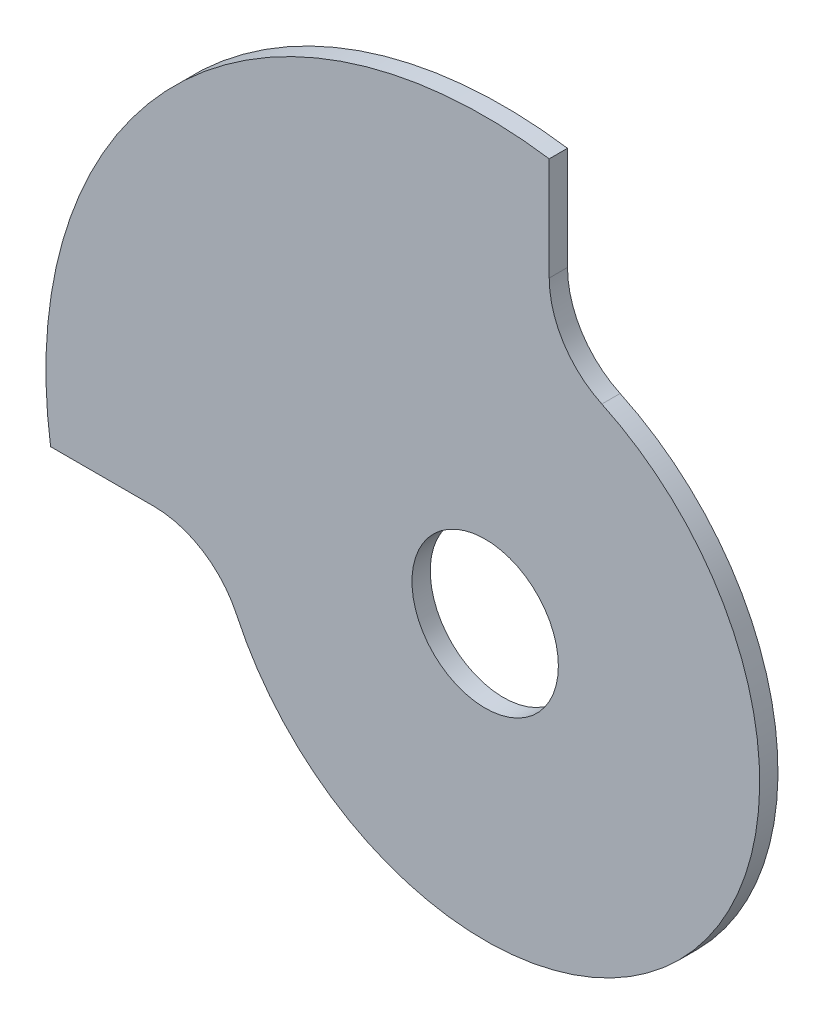
ISO-10303-21;
HEADER;
FILE_DESCRIPTION(('STEP AP214'),'2;1');
FILE_NAME('part.step','',(''),(''),'','','');
FILE_SCHEMA(('AUTOMOTIVE_DESIGN { 1 0 10303 214 1 1 1 1 }'));
ENDSEC;
DATA;
#1=APPLICATION_CONTEXT('core data for automotive mechanical design processes');
#2=APPLICATION_PROTOCOL_DEFINITION('international standard','automotive_design',2000,#1);
#3=PRODUCT_CONTEXT('',#1,'mechanical');
#4=PRODUCT('Part','Part','',(#3));
#5=PRODUCT_RELATED_PRODUCT_CATEGORY('part','',(#4));
#6=PRODUCT_DEFINITION_FORMATION('','',#4);
#7=PRODUCT_DEFINITION_CONTEXT('part definition',#1,'design');
#8=PRODUCT_DEFINITION('design','',#6,#7);
#9=PRODUCT_DEFINITION_SHAPE('','',#8);
#10=(LENGTH_UNIT() NAMED_UNIT(*) SI_UNIT(.MILLI.,.METRE.));
#11=(NAMED_UNIT(*) PLANE_ANGLE_UNIT() SI_UNIT($,.RADIAN.));
#12=(NAMED_UNIT(*) SI_UNIT($,.STERADIAN.) SOLID_ANGLE_UNIT());
#13=UNCERTAINTY_MEASURE_WITH_UNIT(LENGTH_MEASURE(1.E-05),#10,'distance_accuracy_value','');
#14=(GEOMETRIC_REPRESENTATION_CONTEXT(3) GLOBAL_UNCERTAINTY_ASSIGNED_CONTEXT((#13)) GLOBAL_UNIT_ASSIGNED_CONTEXT((#10,
#11,#12)) REPRESENTATION_CONTEXT('',''));
#15=CARTESIAN_POINT('',(0.,0.,0.));
#16=DIRECTION('',(0.,0.,1.));
#17=DIRECTION('',(1.,0.,0.));
#18=AXIS2_PLACEMENT_3D('',#15,#16,#17);
#19=CARTESIAN_POINT('',(0.,0.,1.));
#20=DIRECTION('',(0.,0.,-1.));
#21=DIRECTION('',(-1.,0.,0.));
#22=AXIS2_PLACEMENT_3D('',#19,#20,#21);
#23=CYLINDRICAL_SURFACE('',#22,24.);
#24=CARTESIAN_POINT('',(0.,0.,0.));
#25=DIRECTION('',(0.,0.,1.));
#26=DIRECTION('',(1.,0.,0.));
#27=AXIS2_PLACEMENT_3D('',#24,#25,#26);
#28=CIRCLE('',#27,24.);
#29=CARTESIAN_POINT('',(3.5,23.7434201411675,0.));
#30=VERTEX_POINT('',#29);
#31=CARTESIAN_POINT('',(-23.7434201411675,-3.5,0.));
#32=VERTEX_POINT('',#31);
#33=EDGE_CURVE('E101',#30,#32,#28,.T.);
#34=ORIENTED_EDGE('',*,*,#33,.T.);
#35=DIRECTION('',(0.,0.,1.));
#36=VECTOR('',#35,1.);
#37=CARTESIAN_POINT('',(-23.7434201411675,-3.5,0.));
#38=LINE('',#37,#36);
#39=CARTESIAN_POINT('',(-23.7434201411675,-3.5,1.));
#40=VERTEX_POINT('',#39);
#41=EDGE_CURVE('E88',#32,#40,#38,.T.);
#42=ORIENTED_EDGE('',*,*,#41,.T.);
#43=CARTESIAN_POINT('',(0.,0.,1.));
#44=DIRECTION('',(0.,0.,1.));
#45=DIRECTION('',(1.,0.,0.));
#46=AXIS2_PLACEMENT_3D('',#43,#44,#45);
#47=CIRCLE('',#46,24.);
#48=CARTESIAN_POINT('',(3.5,23.7434201411675,1.));
#49=VERTEX_POINT('',#48);
#50=EDGE_CURVE('E95',#49,#40,#47,.T.);
#51=ORIENTED_EDGE('',*,*,#50,.F.);
#52=DIRECTION('',(0.,0.,1.));
#53=VECTOR('',#52,1.);
#54=CARTESIAN_POINT('',(3.5,23.7434201411675,0.));
#55=LINE('',#54,#53);
#56=EDGE_CURVE('E80',#30,#49,#55,.T.);
#57=ORIENTED_EDGE('',*,*,#56,.F.);
#58=EDGE_LOOP('',(#34,#42,#51,#57));
#59=FACE_BOUND('',#58,.T.);
#60=ADVANCED_FACE('F31',(#59),#23,.T.);
#61=CARTESIAN_POINT('',(0.,0.,1.));
#62=DIRECTION('',(0.,0.,1.));
#63=DIRECTION('',(1.,0.,0.));
#64=AXIS2_PLACEMENT_3D('',#61,#62,#63);
#65=PLANE('',#64);
#66=DIRECTION('',(-1.,0.,0.));
#67=VECTOR('',#66,1.);
#68=CARTESIAN_POINT('',(-23.7434201411675,-3.5,1.));
#69=LINE('',#68,#67);
#70=CARTESIAN_POINT('',(-18.1038669902317,-3.5,1.));
#71=VERTEX_POINT('',#70);
#72=EDGE_CURVE('E128',#71,#40,#69,.T.);
#73=ORIENTED_EDGE('',*,*,#72,.F.);
#74=CARTESIAN_POINT('',(-18.1038669902317,-8.5,1.));
#75=DIRECTION('',(0.,0.,1.));
#76=DIRECTION('',(1.,0.,0.));
#77=AXIS2_PLACEMENT_3D('',#74,#75,#76);
#78=CIRCLE('',#77,5.);
#79=CARTESIAN_POINT('',(-13.5779002426738,-6.375,1.));
#80=VERTEX_POINT('',#79);
#81=EDGE_CURVE('E112',#71,#80,#78,.F.);
#82=ORIENTED_EDGE('',*,*,#81,.T.);
#83=CARTESIAN_POINT('',(0.,0.,1.));
#84=DIRECTION('',(0.,0.,-1.));
#85=DIRECTION('',(1.,0.,0.));
#86=AXIS2_PLACEMENT_3D('',#83,#84,#85);
#87=CIRCLE('',#86,15.);
#88=CARTESIAN_POINT('',(6.375,13.5779002426738,1.));
#89=VERTEX_POINT('',#88);
#90=EDGE_CURVE('E96',#89,#80,#87,.T.);
#91=ORIENTED_EDGE('',*,*,#90,.F.);
#92=CARTESIAN_POINT('',(8.5,18.1038669902317,1.));
#93=DIRECTION('',(0.,0.,1.));
#94=DIRECTION('',(1.,0.,0.));
#95=AXIS2_PLACEMENT_3D('',#92,#93,#94);
#96=CIRCLE('',#95,5.);
#97=CARTESIAN_POINT('',(3.5,18.1038669902317,1.));
#98=VERTEX_POINT('',#97);
#99=EDGE_CURVE('E38',#89,#98,#96,.F.);
#100=ORIENTED_EDGE('',*,*,#99,.T.);
#101=DIRECTION('',(0.,-1.,0.));
#102=VECTOR('',#101,1.);
#103=CARTESIAN_POINT('',(3.5,14.5859521458148,1.));
#104=LINE('',#103,#102);
#105=EDGE_CURVE('E82',#49,#98,#104,.T.);
#106=ORIENTED_EDGE('',*,*,#105,.F.);
#107=ORIENTED_EDGE('',*,*,#50,.T.);
#108=EDGE_LOOP('',(#73,#82,#91,#100,#106,#107));
#109=FACE_BOUND('',#108,.T.);
#110=CARTESIAN_POINT('',(0.,0.,1.));
#111=DIRECTION('',(0.,0.,1.));
#112=DIRECTION('',(1.,0.,0.));
#113=AXIS2_PLACEMENT_3D('',#110,#111,#112);
#114=CIRCLE('',#113,4.);
#115=CARTESIAN_POINT('',(4.,0.,1.));
#116=VERTEX_POINT('',#115);
#117=EDGE_CURVE('E135',#116,#116,#114,.T.);
#118=ORIENTED_EDGE('',*,*,#117,.F.);
#119=EDGE_LOOP('',(#118));
#120=FACE_BOUND('',#119,.T.);
#121=ADVANCED_FACE('F93',(#109,#120),#65,.T.);
#122=CARTESIAN_POINT('',(0.,0.,0.));
#123=DIRECTION('',(0.,0.,1.));
#124=DIRECTION('',(1.,0.,0.));
#125=AXIS2_PLACEMENT_3D('',#122,#123,#124);
#126=PLANE('',#125);
#127=CARTESIAN_POINT('',(0.,0.,0.));
#128=DIRECTION('',(0.,0.,1.));
#129=DIRECTION('',(1.,0.,0.));
#130=AXIS2_PLACEMENT_3D('',#127,#128,#129);
#131=CIRCLE('',#130,4.);
#132=CARTESIAN_POINT('',(4.,0.,0.));
#133=VERTEX_POINT('',#132);
#134=EDGE_CURVE('E106',#133,#133,#131,.T.);
#135=ORIENTED_EDGE('',*,*,#134,.T.);
#136=EDGE_LOOP('',(#135));
#137=FACE_BOUND('',#136,.T.);
#138=DIRECTION('',(0.,-1.,0.));
#139=VECTOR('',#138,1.);
#140=CARTESIAN_POINT('',(3.5,14.5859521458148,0.));
#141=LINE('',#140,#139);
#142=CARTESIAN_POINT('',(3.5,18.1038669902317,0.));
#143=VERTEX_POINT('',#142);
#144=EDGE_CURVE('E83',#30,#143,#141,.T.);
#145=ORIENTED_EDGE('',*,*,#144,.T.);
#146=CARTESIAN_POINT('',(8.5,18.1038669902317,0.));
#147=DIRECTION('',(0.,0.,1.));
#148=DIRECTION('',(1.,0.,0.));
#149=AXIS2_PLACEMENT_3D('',#146,#147,#148);
#150=CIRCLE('',#149,5.);
#151=CARTESIAN_POINT('',(6.375,13.5779002426738,0.));
#152=VERTEX_POINT('',#151);
#153=EDGE_CURVE('E11',#143,#152,#150,.T.);
#154=ORIENTED_EDGE('',*,*,#153,.T.);
#155=CARTESIAN_POINT('',(0.,0.,0.));
#156=DIRECTION('',(0.,0.,-1.));
#157=DIRECTION('',(1.,0.,0.));
#158=AXIS2_PLACEMENT_3D('',#155,#156,#157);
#159=CIRCLE('',#158,15.);
#160=CARTESIAN_POINT('',(-13.5779002426738,-6.375,0.));
#161=VERTEX_POINT('',#160);
#162=EDGE_CURVE('E124',#152,#161,#159,.T.);
#163=ORIENTED_EDGE('',*,*,#162,.T.);
#164=CARTESIAN_POINT('',(-18.1038669902317,-8.5,0.));
#165=DIRECTION('',(0.,0.,1.));
#166=DIRECTION('',(1.,0.,0.));
#167=AXIS2_PLACEMENT_3D('',#164,#165,#166);
#168=CIRCLE('',#167,5.);
#169=CARTESIAN_POINT('',(-18.1038669902317,-3.5,0.));
#170=VERTEX_POINT('',#169);
#171=EDGE_CURVE('E115',#161,#170,#168,.T.);
#172=ORIENTED_EDGE('',*,*,#171,.T.);
#173=DIRECTION('',(-1.,0.,0.));
#174=VECTOR('',#173,1.);
#175=CARTESIAN_POINT('',(-23.7434201411675,-3.5,0.));
#176=LINE('',#175,#174);
#177=EDGE_CURVE('E89',#170,#32,#176,.T.);
#178=ORIENTED_EDGE('',*,*,#177,.T.);
#179=ORIENTED_EDGE('',*,*,#33,.F.);
#180=EDGE_LOOP('',(#145,#154,#163,#172,#178,#179));
#181=FACE_BOUND('',#180,.T.);
#182=ADVANCED_FACE('F141',(#137,#181),#126,.F.);
#183=CARTESIAN_POINT('',(0.,0.,0.));
#184=DIRECTION('',(0.,0.,1.));
#185=DIRECTION('',(1.,0.,0.));
#186=AXIS2_PLACEMENT_3D('',#183,#184,#185);
#187=CYLINDRICAL_SURFACE('',#186,4.);
#188=ORIENTED_EDGE('',*,*,#134,.F.);
#189=EDGE_LOOP('',(#188));
#190=FACE_BOUND('',#189,.T.);
#191=ORIENTED_EDGE('',*,*,#117,.T.);
#192=EDGE_LOOP('',(#191));
#193=FACE_BOUND('',#192,.T.);
#194=ADVANCED_FACE('F144',(#190,#193),#187,.F.);
#195=CARTESIAN_POINT('',(-23.7434201411675,-3.5,0.));
#196=DIRECTION('',(0.,1.,0.));
#197=DIRECTION('',(0.,0.,1.));
#198=AXIS2_PLACEMENT_3D('',#195,#196,#197);
#199=PLANE('',#198);
#200=ORIENTED_EDGE('',*,*,#177,.F.);
#201=DIRECTION('',(0.,0.,-1.));
#202=VECTOR('',#201,1.);
#203=CARTESIAN_POINT('',(-18.1038669902317,-3.5,1.));
#204=LINE('',#203,#202);
#205=EDGE_CURVE('E100',#170,#71,#204,.F.);
#206=ORIENTED_EDGE('',*,*,#205,.T.);
#207=ORIENTED_EDGE('',*,*,#72,.T.);
#208=ORIENTED_EDGE('',*,*,#41,.F.);
#209=EDGE_LOOP('',(#200,#206,#207,#208));
#210=FACE_BOUND('',#209,.T.);
#211=ADVANCED_FACE('F147',(#210),#199,.F.);
#212=CARTESIAN_POINT('',(0.,0.,0.));
#213=DIRECTION('',(0.,0.,1.));
#214=DIRECTION('',(1.,0.,0.));
#215=AXIS2_PLACEMENT_3D('',#212,#213,#214);
#216=CYLINDRICAL_SURFACE('',#215,15.);
#217=ORIENTED_EDGE('',*,*,#162,.F.);
#218=DIRECTION('',(0.,0.,1.));
#219=VECTOR('',#218,1.);
#220=CARTESIAN_POINT('',(6.375,13.5779002426738,0.));
#221=LINE('',#220,#219);
#222=EDGE_CURVE('E117',#152,#89,#221,.T.);
#223=ORIENTED_EDGE('',*,*,#222,.T.);
#224=ORIENTED_EDGE('',*,*,#90,.T.);
#225=DIRECTION('',(0.,0.,1.));
#226=VECTOR('',#225,1.);
#227=CARTESIAN_POINT('',(-13.5779002426738,-6.375,0.));
#228=LINE('',#227,#226);
#229=EDGE_CURVE('E104',#80,#161,#228,.F.);
#230=ORIENTED_EDGE('',*,*,#229,.T.);
#231=EDGE_LOOP('',(#217,#223,#224,#230));
#232=FACE_BOUND('',#231,.T.);
#233=ADVANCED_FACE('F123',(#232),#216,.T.);
#234=CARTESIAN_POINT('',(3.5,14.5859521458148,0.));
#235=DIRECTION('',(-1.,0.,0.));
#236=DIRECTION('',(0.,-1.,0.));
#237=AXIS2_PLACEMENT_3D('',#234,#235,#236);
#238=PLANE('',#237);
#239=ORIENTED_EDGE('',*,*,#105,.T.);
#240=DIRECTION('',(0.,0.,-1.));
#241=VECTOR('',#240,1.);
#242=CARTESIAN_POINT('',(3.5,18.1038669902317,0.));
#243=LINE('',#242,#241);
#244=EDGE_CURVE('E45',#98,#143,#243,.T.);
#245=ORIENTED_EDGE('',*,*,#244,.T.);
#246=ORIENTED_EDGE('',*,*,#144,.F.);
#247=ORIENTED_EDGE('',*,*,#56,.T.);
#248=EDGE_LOOP('',(#239,#245,#246,#247));
#249=FACE_BOUND('',#248,.T.);
#250=ADVANCED_FACE('F81',(#249),#238,.F.);
#251=CARTESIAN_POINT('',(-18.1038669902317,-8.5,0.));
#252=DIRECTION('',(0.,0.,1.));
#253=DIRECTION('',(1.,0.,0.));
#254=AXIS2_PLACEMENT_3D('',#251,#252,#253);
#255=CYLINDRICAL_SURFACE('',#254,5.);
#256=ORIENTED_EDGE('',*,*,#171,.F.);
#257=ORIENTED_EDGE('',*,*,#229,.F.);
#258=ORIENTED_EDGE('',*,*,#81,.F.);
#259=ORIENTED_EDGE('',*,*,#205,.F.);
#260=EDGE_LOOP('',(#256,#257,#258,#259));
#261=FACE_BOUND('',#260,.T.);
#262=ADVANCED_FACE('F159',(#261),#255,.F.);
#263=CARTESIAN_POINT('',(8.5,18.1038669902317,0.));
#264=DIRECTION('',(0.,0.,1.));
#265=DIRECTION('',(1.,0.,0.));
#266=AXIS2_PLACEMENT_3D('',#263,#264,#265);
#267=CYLINDRICAL_SURFACE('',#266,5.);
#268=ORIENTED_EDGE('',*,*,#153,.F.);
#269=ORIENTED_EDGE('',*,*,#244,.F.);
#270=ORIENTED_EDGE('',*,*,#99,.F.);
#271=ORIENTED_EDGE('',*,*,#222,.F.);
#272=EDGE_LOOP('',(#268,#269,#270,#271));
#273=FACE_BOUND('',#272,.T.);
#274=ADVANCED_FACE('F167',(#273),#267,.F.);
#275=CLOSED_SHELL('',(#60,#121,#182,#194,#211,#233,#250,#262,#274));
#276=MANIFOLD_SOLID_BREP('B2',#275);
#277=ADVANCED_BREP_SHAPE_REPRESENTATION('',(#18,#276),#14);
#278=SHAPE_DEFINITION_REPRESENTATION(#9,#277);
ENDSEC;
END-ISO-10303-21;
